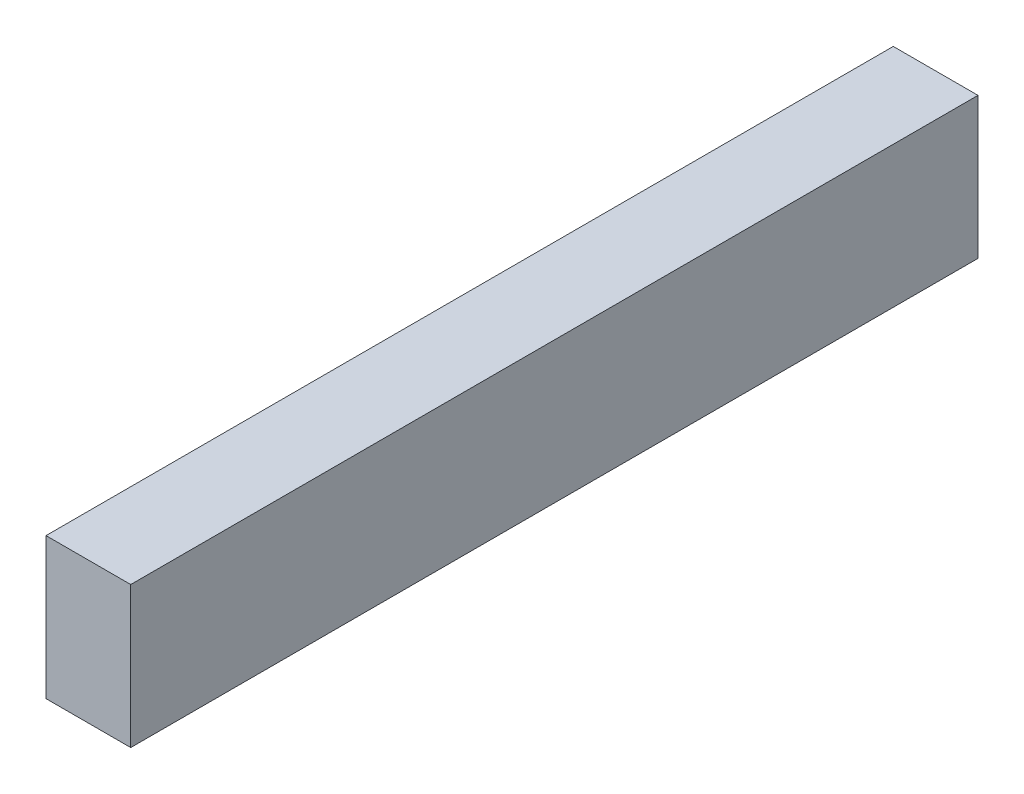
ISO-10303-21;
HEADER;
FILE_DESCRIPTION(('STEP AP214'),'2;1');
FILE_NAME('part.step','',(''),(''),'','','');
FILE_SCHEMA(('AUTOMOTIVE_DESIGN { 1 0 10303 214 1 1 1 1 }'));
ENDSEC;
DATA;
#1=APPLICATION_CONTEXT('core data for automotive mechanical design processes');
#2=APPLICATION_PROTOCOL_DEFINITION('international standard','automotive_design',2000,#1);
#3=PRODUCT_CONTEXT('',#1,'mechanical');
#4=PRODUCT('Part','Part','',(#3));
#5=PRODUCT_RELATED_PRODUCT_CATEGORY('part','',(#4));
#6=PRODUCT_DEFINITION_FORMATION('','',#4);
#7=PRODUCT_DEFINITION_CONTEXT('part definition',#1,'design');
#8=PRODUCT_DEFINITION('design','',#6,#7);
#9=PRODUCT_DEFINITION_SHAPE('','',#8);
#10=(LENGTH_UNIT() NAMED_UNIT(*) SI_UNIT(.MILLI.,.METRE.));
#11=(NAMED_UNIT(*) PLANE_ANGLE_UNIT() SI_UNIT($,.RADIAN.));
#12=(NAMED_UNIT(*) SI_UNIT($,.STERADIAN.) SOLID_ANGLE_UNIT());
#13=UNCERTAINTY_MEASURE_WITH_UNIT(LENGTH_MEASURE(1.E-05),#10,'distance_accuracy_value','');
#14=(GEOMETRIC_REPRESENTATION_CONTEXT(3) GLOBAL_UNCERTAINTY_ASSIGNED_CONTEXT((#13)) GLOBAL_UNIT_ASSIGNED_CONTEXT((#10,
#11,#12)) REPRESENTATION_CONTEXT('',''));
#15=CARTESIAN_POINT('',(0.,0.,0.));
#16=DIRECTION('',(0.,0.,1.));
#17=DIRECTION('',(1.,0.,0.));
#18=AXIS2_PLACEMENT_3D('',#15,#16,#17);
#19=CARTESIAN_POINT('',(15.,25.,300.));
#20=DIRECTION('',(-1.,0.,0.));
#21=DIRECTION('',(0.,-1.,0.));
#22=AXIS2_PLACEMENT_3D('',#19,#20,#21);
#23=PLANE('',#22);
#24=DIRECTION('',(0.,1.,0.));
#25=VECTOR('',#24,1.);
#26=CARTESIAN_POINT('',(15.,25.,0.));
#27=LINE('',#26,#25);
#28=CARTESIAN_POINT('',(15.,-25.,0.));
#29=VERTEX_POINT('',#28);
#30=CARTESIAN_POINT('',(15.,25.,0.));
#31=VERTEX_POINT('',#30);
#32=EDGE_CURVE('E107',#29,#31,#27,.T.);
#33=ORIENTED_EDGE('',*,*,#32,.T.);
#34=DIRECTION('',(0.,0.,-1.));
#35=VECTOR('',#34,1.);
#36=CARTESIAN_POINT('',(15.,25.,300.));
#37=LINE('',#36,#35);
#38=CARTESIAN_POINT('',(15.,25.,300.));
#39=VERTEX_POINT('',#38);
#40=EDGE_CURVE('E11',#39,#31,#37,.T.);
#41=ORIENTED_EDGE('',*,*,#40,.F.);
#42=DIRECTION('',(0.,1.,0.));
#43=VECTOR('',#42,1.);
#44=CARTESIAN_POINT('',(15.,25.,300.));
#45=LINE('',#44,#43);
#46=CARTESIAN_POINT('',(15.,-25.,300.));
#47=VERTEX_POINT('',#46);
#48=EDGE_CURVE('E91',#47,#39,#45,.T.);
#49=ORIENTED_EDGE('',*,*,#48,.F.);
#50=DIRECTION('',(0.,0.,-1.));
#51=VECTOR('',#50,1.);
#52=CARTESIAN_POINT('',(15.,-25.,300.));
#53=LINE('',#52,#51);
#54=EDGE_CURVE('E103',#47,#29,#53,.T.);
#55=ORIENTED_EDGE('',*,*,#54,.T.);
#56=EDGE_LOOP('',(#33,#41,#49,#55));
#57=FACE_BOUND('',#56,.T.);
#58=ADVANCED_FACE('F39',(#57),#23,.F.);
#59=CARTESIAN_POINT('',(-15.,25.,300.));
#60=DIRECTION('',(0.,-1.,0.));
#61=DIRECTION('',(0.,0.,-1.));
#62=AXIS2_PLACEMENT_3D('',#59,#60,#61);
#63=PLANE('',#62);
#64=DIRECTION('',(-1.,0.,0.));
#65=VECTOR('',#64,1.);
#66=CARTESIAN_POINT('',(-15.,25.,0.));
#67=LINE('',#66,#65);
#68=CARTESIAN_POINT('',(-15.,25.,0.));
#69=VERTEX_POINT('',#68);
#70=EDGE_CURVE('E96',#31,#69,#67,.T.);
#71=ORIENTED_EDGE('',*,*,#70,.T.);
#72=DIRECTION('',(0.,0.,-1.));
#73=VECTOR('',#72,1.);
#74=CARTESIAN_POINT('',(-15.,25.,300.));
#75=LINE('',#74,#73);
#76=CARTESIAN_POINT('',(-15.,25.,300.));
#77=VERTEX_POINT('',#76);
#78=EDGE_CURVE('E48',#77,#69,#75,.T.);
#79=ORIENTED_EDGE('',*,*,#78,.F.);
#80=DIRECTION('',(-1.,0.,0.));
#81=VECTOR('',#80,1.);
#82=CARTESIAN_POINT('',(-15.,25.,300.));
#83=LINE('',#82,#81);
#84=EDGE_CURVE('E86',#39,#77,#83,.T.);
#85=ORIENTED_EDGE('',*,*,#84,.F.);
#86=ORIENTED_EDGE('',*,*,#40,.T.);
#87=EDGE_LOOP('',(#71,#79,#85,#86));
#88=FACE_BOUND('',#87,.T.);
#89=ADVANCED_FACE('F95',(#88),#63,.F.);
#90=CARTESIAN_POINT('',(-15.,25.,300.));
#91=DIRECTION('',(1.,0.,0.));
#92=DIRECTION('',(0.,1.,0.));
#93=AXIS2_PLACEMENT_3D('',#90,#91,#92);
#94=PLANE('',#93);
#95=DIRECTION('',(0.,-1.,0.));
#96=VECTOR('',#95,1.);
#97=CARTESIAN_POINT('',(-15.,25.,0.));
#98=LINE('',#97,#96);
#99=CARTESIAN_POINT('',(-15.,-25.,0.));
#100=VERTEX_POINT('',#99);
#101=EDGE_CURVE('E73',#69,#100,#98,.T.);
#102=ORIENTED_EDGE('',*,*,#101,.T.);
#103=DIRECTION('',(0.,0.,-1.));
#104=VECTOR('',#103,1.);
#105=CARTESIAN_POINT('',(-15.,-25.,300.));
#106=LINE('',#105,#104);
#107=CARTESIAN_POINT('',(-15.,-25.,300.));
#108=VERTEX_POINT('',#107);
#109=EDGE_CURVE('E98',#108,#100,#106,.T.);
#110=ORIENTED_EDGE('',*,*,#109,.F.);
#111=DIRECTION('',(0.,-1.,0.));
#112=VECTOR('',#111,1.);
#113=CARTESIAN_POINT('',(-15.,25.,300.));
#114=LINE('',#113,#112);
#115=EDGE_CURVE('E89',#77,#108,#114,.T.);
#116=ORIENTED_EDGE('',*,*,#115,.F.);
#117=ORIENTED_EDGE('',*,*,#78,.T.);
#118=EDGE_LOOP('',(#102,#110,#116,#117));
#119=FACE_BOUND('',#118,.T.);
#120=ADVANCED_FACE('F99',(#119),#94,.F.);
#121=CARTESIAN_POINT('',(-15.,-25.,300.));
#122=DIRECTION('',(0.,1.,0.));
#123=DIRECTION('',(0.,0.,1.));
#124=AXIS2_PLACEMENT_3D('',#121,#122,#123);
#125=PLANE('',#124);
#126=DIRECTION('',(1.,0.,0.));
#127=VECTOR('',#126,1.);
#128=CARTESIAN_POINT('',(-15.,-25.,0.));
#129=LINE('',#128,#127);
#130=EDGE_CURVE('E79',#100,#29,#129,.T.);
#131=ORIENTED_EDGE('',*,*,#130,.T.);
#132=ORIENTED_EDGE('',*,*,#54,.F.);
#133=DIRECTION('',(1.,0.,0.));
#134=VECTOR('',#133,1.);
#135=CARTESIAN_POINT('',(-15.,-25.,300.));
#136=LINE('',#135,#134);
#137=EDGE_CURVE('E56',#108,#47,#136,.T.);
#138=ORIENTED_EDGE('',*,*,#137,.F.);
#139=ORIENTED_EDGE('',*,*,#109,.T.);
#140=EDGE_LOOP('',(#131,#132,#138,#139));
#141=FACE_BOUND('',#140,.T.);
#142=ADVANCED_FACE('F120',(#141),#125,.F.);
#143=CARTESIAN_POINT('',(0.,0.,300.));
#144=DIRECTION('',(0.,0.,1.));
#145=DIRECTION('',(1.,0.,0.));
#146=AXIS2_PLACEMENT_3D('',#143,#144,#145);
#147=PLANE('',#146);
#148=ORIENTED_EDGE('',*,*,#48,.T.);
#149=ORIENTED_EDGE('',*,*,#84,.T.);
#150=ORIENTED_EDGE('',*,*,#115,.T.);
#151=ORIENTED_EDGE('',*,*,#137,.T.);
#152=EDGE_LOOP('',(#148,#149,#150,#151));
#153=FACE_BOUND('',#152,.T.);
#154=ADVANCED_FACE('F87',(#153),#147,.T.);
#155=CARTESIAN_POINT('',(0.,0.,0.));
#156=DIRECTION('',(0.,0.,1.));
#157=DIRECTION('',(1.,0.,0.));
#158=AXIS2_PLACEMENT_3D('',#155,#156,#157);
#159=PLANE('',#158);
#160=ORIENTED_EDGE('',*,*,#32,.F.);
#161=ORIENTED_EDGE('',*,*,#130,.F.);
#162=ORIENTED_EDGE('',*,*,#101,.F.);
#163=ORIENTED_EDGE('',*,*,#70,.F.);
#164=EDGE_LOOP('',(#160,#161,#162,#163));
#165=FACE_BOUND('',#164,.T.);
#166=ADVANCED_FACE('F123',(#165),#159,.F.);
#167=CLOSED_SHELL('',(#58,#89,#120,#142,#154,#166));
#168=MANIFOLD_SOLID_BREP('B2',#167);
#169=ADVANCED_BREP_SHAPE_REPRESENTATION('',(#18,#168),#14);
#170=SHAPE_DEFINITION_REPRESENTATION(#9,#169);
ENDSEC;
END-ISO-10303-21;
